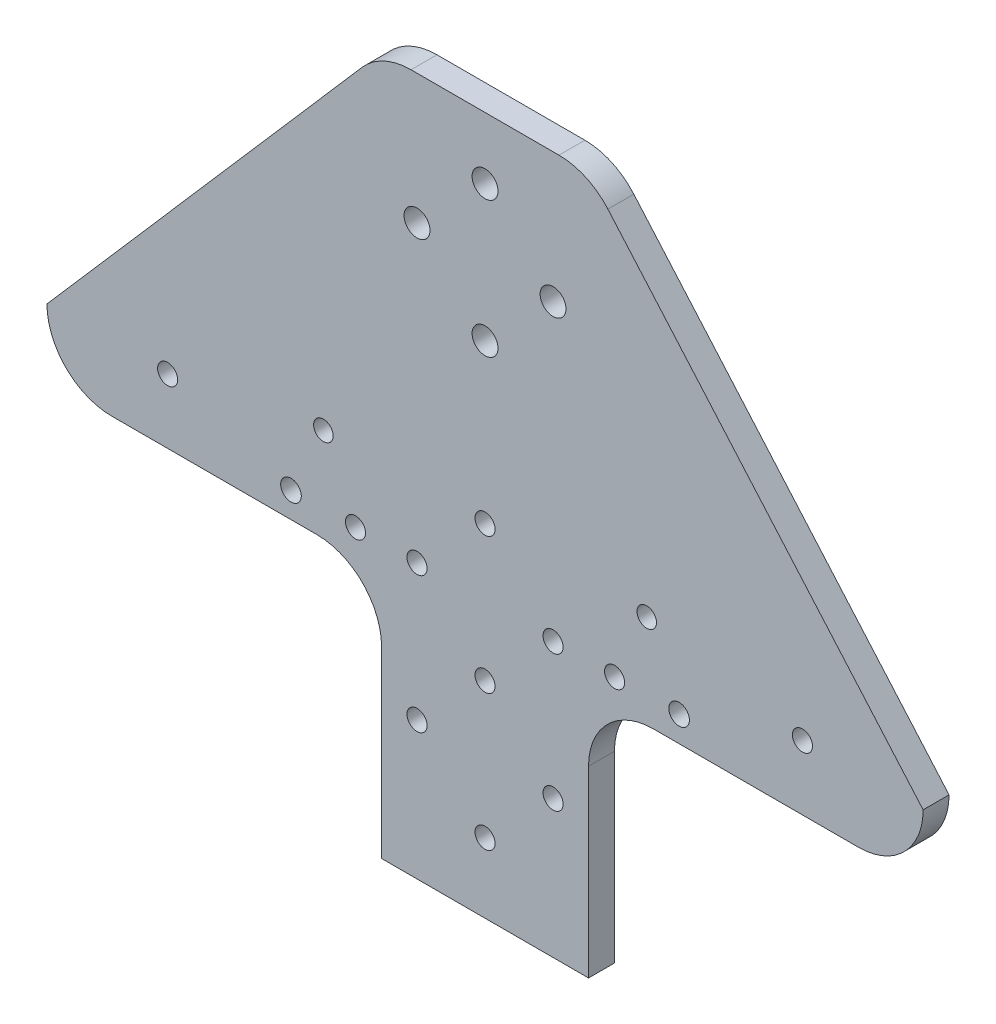
ISO-10303-21;
HEADER;
FILE_DESCRIPTION(('STEP AP214'),'2;1');
FILE_NAME('part.step','',(''),(''),'','','');
FILE_SCHEMA(('AUTOMOTIVE_DESIGN { 1 0 10303 214 1 1 1 1 }'));
ENDSEC;
DATA;
#1=APPLICATION_CONTEXT('core data for automotive mechanical design processes');
#2=APPLICATION_PROTOCOL_DEFINITION('international standard','automotive_design',2000,#1);
#3=PRODUCT_CONTEXT('',#1,'mechanical');
#4=PRODUCT('Part','Part','',(#3));
#5=PRODUCT_RELATED_PRODUCT_CATEGORY('part','',(#4));
#6=PRODUCT_DEFINITION_FORMATION('','',#4);
#7=PRODUCT_DEFINITION_CONTEXT('part definition',#1,'design');
#8=PRODUCT_DEFINITION('design','',#6,#7);
#9=PRODUCT_DEFINITION_SHAPE('','',#8);
#10=(LENGTH_UNIT() NAMED_UNIT(*) SI_UNIT(.MILLI.,.METRE.));
#11=(NAMED_UNIT(*) PLANE_ANGLE_UNIT() SI_UNIT($,.RADIAN.));
#12=(NAMED_UNIT(*) SI_UNIT($,.STERADIAN.) SOLID_ANGLE_UNIT());
#13=UNCERTAINTY_MEASURE_WITH_UNIT(LENGTH_MEASURE(1.E-05),#10,'distance_accuracy_value','');
#14=(GEOMETRIC_REPRESENTATION_CONTEXT(3) GLOBAL_UNCERTAINTY_ASSIGNED_CONTEXT((#13)) GLOBAL_UNIT_ASSIGNED_CONTEXT((#10,
#11,#12)) REPRESENTATION_CONTEXT('',''));
#15=CARTESIAN_POINT('',(0.,0.,0.));
#16=DIRECTION('',(0.,0.,1.));
#17=DIRECTION('',(1.,0.,0.));
#18=AXIS2_PLACEMENT_3D('',#15,#16,#17);
#19=CARTESIAN_POINT('',(-2.87536121791767,41.2867791801597,4.));
#20=DIRECTION('',(0.,0.,-1.));
#21=DIRECTION('',(-1.,0.,0.));
#22=AXIS2_PLACEMENT_3D('',#19,#20,#21);
#23=CYLINDRICAL_SURFACE('',#22,10.);
#24=CARTESIAN_POINT('',(-2.87536121791767,41.2867791801597,0.));
#25=DIRECTION('',(0.,0.,1.));
#26=DIRECTION('',(1.,0.,0.));
#27=AXIS2_PLACEMENT_3D('',#24,#25,#26);
#28=CIRCLE('',#27,10.);
#29=CARTESIAN_POINT('',(-10.4221156167999,47.8477621890504,0.));
#30=VERTEX_POINT('',#29);
#31=CARTESIAN_POINT('',(-2.87536121791763,51.2867791801597,0.));
#32=VERTEX_POINT('',#31);
#33=EDGE_CURVE('E227',#30,#32,#28,.F.);
#34=ORIENTED_EDGE('',*,*,#33,.F.);
#35=DIRECTION('',(0.,0.,-1.));
#36=VECTOR('',#35,1.);
#37=CARTESIAN_POINT('',(-10.4221156167999,47.8477621890504,4.));
#38=LINE('',#37,#36);
#39=CARTESIAN_POINT('',(-10.4221156167999,47.8477621890504,4.));
#40=VERTEX_POINT('',#39);
#41=EDGE_CURVE('E11',#40,#30,#38,.T.);
#42=ORIENTED_EDGE('',*,*,#41,.F.);
#43=CARTESIAN_POINT('',(-2.87536121791767,41.2867791801597,4.));
#44=DIRECTION('',(0.,0.,1.));
#45=DIRECTION('',(1.,0.,0.));
#46=AXIS2_PLACEMENT_3D('',#43,#44,#45);
#47=CIRCLE('',#46,10.);
#48=CARTESIAN_POINT('',(-2.87536121791763,51.2867791801597,4.));
#49=VERTEX_POINT('',#48);
#50=EDGE_CURVE('E319',#40,#49,#47,.F.);
#51=ORIENTED_EDGE('',*,*,#50,.T.);
#52=DIRECTION('',(0.,0.,-1.));
#53=VECTOR('',#52,1.);
#54=CARTESIAN_POINT('',(-2.87536121791763,51.2867791801597,4.));
#55=LINE('',#54,#53);
#56=EDGE_CURVE('E110',#49,#32,#55,.T.);
#57=ORIENTED_EDGE('',*,*,#56,.T.);
#58=EDGE_LOOP('',(#34,#42,#51,#57));
#59=FACE_BOUND('',#58,.T.);
#60=ADVANCED_FACE('F41',(#59),#23,.T.);
#61=CARTESIAN_POINT('',(-29.6271617421425,25.7572056168472,4.));
#62=DIRECTION('',(-0.754675439888216,0.656098300889072,0.));
#63=DIRECTION('',(-0.656098300889072,-0.754675439888216,0.));
#64=AXIS2_PLACEMENT_3D('',#61,#62,#63);
#65=PLANE('',#64);
#66=DIRECTION('',(0.656098300889072,0.754675439888217,0.));
#67=VECTOR('',#66,1.);
#68=CARTESIAN_POINT('',(-29.6271617421425,25.7572056168472,0.));
#69=LINE('',#68,#67);
#70=CARTESIAN_POINT('',(-59.0860641716321,-8.12782368359886,0.));
#71=VERTEX_POINT('',#70);
#72=EDGE_CURVE('E230',#71,#30,#69,.T.);
#73=ORIENTED_EDGE('',*,*,#72,.F.);
#74=DIRECTION('',(0.,0.,-1.));
#75=VECTOR('',#74,1.);
#76=CARTESIAN_POINT('',(-59.0860641716321,-8.12782368359886,4.));
#77=LINE('',#76,#75);
#78=CARTESIAN_POINT('',(-59.0860641716321,-8.12782368359886,4.));
#79=VERTEX_POINT('',#78);
#80=EDGE_CURVE('E49',#79,#71,#77,.T.);
#81=ORIENTED_EDGE('',*,*,#80,.F.);
#82=DIRECTION('',(0.656098300889072,0.754675439888217,0.));
#83=VECTOR('',#82,1.);
#84=CARTESIAN_POINT('',(-29.6271617421425,25.7572056168472,4.));
#85=LINE('',#84,#83);
#86=EDGE_CURVE('E363',#79,#40,#85,.T.);
#87=ORIENTED_EDGE('',*,*,#86,.T.);
#88=ORIENTED_EDGE('',*,*,#41,.T.);
#89=EDGE_LOOP('',(#73,#81,#87,#88));
#90=FACE_BOUND('',#89,.T.);
#91=ADVANCED_FACE('F350',(#90),#65,.T.);
#92=CARTESIAN_POINT('',(-49.0860641716321,-8.12782368359894,4.));
#93=DIRECTION('',(0.,0.,-1.));
#94=DIRECTION('',(-1.,0.,0.));
#95=AXIS2_PLACEMENT_3D('',#92,#93,#94);
#96=CYLINDRICAL_SURFACE('',#95,10.);
#97=CARTESIAN_POINT('',(-49.0860641716321,-8.12782368359894,0.));
#98=DIRECTION('',(0.,0.,1.));
#99=DIRECTION('',(1.,0.,0.));
#100=AXIS2_PLACEMENT_3D('',#97,#98,#99);
#101=CIRCLE('',#100,10.);
#102=CARTESIAN_POINT('',(-49.086064171632,-18.1278236835989,0.));
#103=VERTEX_POINT('',#102);
#104=EDGE_CURVE('E233',#103,#71,#101,.F.);
#105=ORIENTED_EDGE('',*,*,#104,.F.);
#106=DIRECTION('',(0.,0.,-1.));
#107=VECTOR('',#106,1.);
#108=CARTESIAN_POINT('',(-49.086064171632,-18.1278236835989,4.));
#109=LINE('',#108,#107);
#110=CARTESIAN_POINT('',(-49.086064171632,-18.1278236835989,4.));
#111=VERTEX_POINT('',#110);
#112=EDGE_CURVE('E339',#111,#103,#109,.T.);
#113=ORIENTED_EDGE('',*,*,#112,.F.);
#114=CARTESIAN_POINT('',(-49.0860641716321,-8.12782368359894,4.));
#115=DIRECTION('',(0.,0.,1.));
#116=DIRECTION('',(1.,0.,0.));
#117=AXIS2_PLACEMENT_3D('',#114,#115,#116);
#118=CIRCLE('',#117,10.);
#119=EDGE_CURVE('E346',#111,#79,#118,.F.);
#120=ORIENTED_EDGE('',*,*,#119,.T.);
#121=ORIENTED_EDGE('',*,*,#80,.T.);
#122=EDGE_LOOP('',(#105,#113,#120,#121));
#123=FACE_BOUND('',#122,.T.);
#124=ADVANCED_FACE('F344',(#123),#96,.T.);
#125=CARTESIAN_POINT('',(0.,-18.1278236835989,4.));
#126=DIRECTION('',(0.,-1.,0.));
#127=DIRECTION('',(0.,0.,-1.));
#128=AXIS2_PLACEMENT_3D('',#125,#126,#127);
#129=PLANE('',#128);
#130=DIRECTION('',(-1.,0.,0.));
#131=VECTOR('',#130,1.);
#132=CARTESIAN_POINT('',(0.,-18.1278236835989,0.));
#133=LINE('',#132,#131);
#134=CARTESIAN_POINT('',(-17.4323095553628,-18.1278236835989,0.));
#135=VERTEX_POINT('',#134);
#136=EDGE_CURVE('E236',#135,#103,#133,.T.);
#137=ORIENTED_EDGE('',*,*,#136,.F.);
#138=DIRECTION('',(0.,0.,-1.));
#139=VECTOR('',#138,1.);
#140=CARTESIAN_POINT('',(-17.4323095553628,-18.1278236835989,4.));
#141=LINE('',#140,#139);
#142=CARTESIAN_POINT('',(-17.4323095553628,-18.1278236835989,4.));
#143=VERTEX_POINT('',#142);
#144=EDGE_CURVE('E337',#143,#135,#141,.T.);
#145=ORIENTED_EDGE('',*,*,#144,.F.);
#146=DIRECTION('',(-1.,0.,0.));
#147=VECTOR('',#146,1.);
#148=CARTESIAN_POINT('',(0.,-18.1278236835989,4.));
#149=LINE('',#148,#147);
#150=EDGE_CURVE('E362',#143,#111,#149,.T.);
#151=ORIENTED_EDGE('',*,*,#150,.T.);
#152=ORIENTED_EDGE('',*,*,#112,.T.);
#153=EDGE_LOOP('',(#137,#145,#151,#152));
#154=FACE_BOUND('',#153,.T.);
#155=ADVANCED_FACE('F358',(#154),#129,.T.);
#156=CARTESIAN_POINT('',(-17.4323095553628,-28.1278236835989,4.));
#157=DIRECTION('',(0.,0.,-1.));
#158=DIRECTION('',(-1.,0.,0.));
#159=AXIS2_PLACEMENT_3D('',#156,#157,#158);
#160=CYLINDRICAL_SURFACE('',#159,9.99999999999999);
#161=CARTESIAN_POINT('',(-17.4323095553628,-28.1278236835989,0.));
#162=DIRECTION('',(0.,0.,1.));
#163=DIRECTION('',(1.,0.,0.));
#164=AXIS2_PLACEMENT_3D('',#161,#162,#163);
#165=CIRCLE('',#164,9.99999999999999);
#166=CARTESIAN_POINT('',(-7.4323095553628,-28.1278236835989,0.));
#167=VERTEX_POINT('',#166);
#168=EDGE_CURVE('E239',#135,#167,#165,.F.);
#169=ORIENTED_EDGE('',*,*,#168,.T.);
#170=DIRECTION('',(0.,0.,-1.));
#171=VECTOR('',#170,1.);
#172=CARTESIAN_POINT('',(-7.4323095553628,-28.1278236835989,4.));
#173=LINE('',#172,#171);
#174=CARTESIAN_POINT('',(-7.4323095553628,-28.1278236835989,4.));
#175=VERTEX_POINT('',#174);
#176=EDGE_CURVE('E334',#175,#167,#173,.T.);
#177=ORIENTED_EDGE('',*,*,#176,.F.);
#178=CARTESIAN_POINT('',(-17.4323095553628,-28.1278236835989,4.));
#179=DIRECTION('',(0.,0.,1.));
#180=DIRECTION('',(1.,0.,0.));
#181=AXIS2_PLACEMENT_3D('',#178,#179,#180);
#182=CIRCLE('',#181,9.99999999999999);
#183=EDGE_CURVE('E365',#143,#175,#182,.F.);
#184=ORIENTED_EDGE('',*,*,#183,.F.);
#185=ORIENTED_EDGE('',*,*,#144,.T.);
#186=EDGE_LOOP('',(#169,#177,#184,#185));
#187=FACE_BOUND('',#186,.T.);
#188=ADVANCED_FACE('F401',(#187),#160,.F.);
#189=CARTESIAN_POINT('',(-7.43230955536281,0.,4.));
#190=DIRECTION('',(1.,0.,0.));
#191=DIRECTION('',(0.,1.,0.));
#192=AXIS2_PLACEMENT_3D('',#189,#190,#191);
#193=PLANE('',#192);
#194=DIRECTION('',(0.,-1.,0.));
#195=VECTOR('',#194,1.);
#196=CARTESIAN_POINT('',(-7.43230955536281,0.,0.));
#197=LINE('',#196,#195);
#198=CARTESIAN_POINT('',(-7.4323095553628,-56.4391465771481,0.));
#199=VERTEX_POINT('',#198);
#200=EDGE_CURVE('E241',#167,#199,#197,.T.);
#201=ORIENTED_EDGE('',*,*,#200,.T.);
#202=DIRECTION('',(0.,0.,-1.));
#203=VECTOR('',#202,1.);
#204=CARTESIAN_POINT('',(-7.4323095553628,-56.4391465771481,4.));
#205=LINE('',#204,#203);
#206=CARTESIAN_POINT('',(-7.4323095553628,-56.4391465771481,4.));
#207=VERTEX_POINT('',#206);
#208=EDGE_CURVE('E331',#207,#199,#205,.T.);
#209=ORIENTED_EDGE('',*,*,#208,.F.);
#210=DIRECTION('',(0.,-1.,0.));
#211=VECTOR('',#210,1.);
#212=CARTESIAN_POINT('',(-7.43230955536281,0.,4.));
#213=LINE('',#212,#211);
#214=EDGE_CURVE('E371',#175,#207,#213,.T.);
#215=ORIENTED_EDGE('',*,*,#214,.F.);
#216=ORIENTED_EDGE('',*,*,#176,.T.);
#217=EDGE_LOOP('',(#201,#209,#215,#216));
#218=FACE_BOUND('',#217,.T.);
#219=ADVANCED_FACE('F404',(#218),#193,.F.);
#220=CARTESIAN_POINT('',(0.,-56.4391465771481,4.));
#221=DIRECTION('',(0.,1.,0.));
#222=DIRECTION('',(0.,0.,1.));
#223=AXIS2_PLACEMENT_3D('',#220,#221,#222);
#224=PLANE('',#223);
#225=DIRECTION('',(1.,0.,0.));
#226=VECTOR('',#225,1.);
#227=CARTESIAN_POINT('',(0.,-56.4391465771481,0.));
#228=LINE('',#227,#226);
#229=CARTESIAN_POINT('',(24.5196982321059,-56.4391465771481,0.));
#230=VERTEX_POINT('',#229);
#231=EDGE_CURVE('E243',#199,#230,#228,.T.);
#232=ORIENTED_EDGE('',*,*,#231,.T.);
#233=DIRECTION('',(0.,0.,-1.));
#234=VECTOR('',#233,1.);
#235=CARTESIAN_POINT('',(24.5196982321059,-56.4391465771481,4.));
#236=LINE('',#235,#234);
#237=CARTESIAN_POINT('',(24.5196982321059,-56.4391465771481,4.));
#238=VERTEX_POINT('',#237);
#239=EDGE_CURVE('E329',#238,#230,#236,.T.);
#240=ORIENTED_EDGE('',*,*,#239,.F.);
#241=DIRECTION('',(1.,0.,0.));
#242=VECTOR('',#241,1.);
#243=CARTESIAN_POINT('',(0.,-56.4391465771481,4.));
#244=LINE('',#243,#242);
#245=EDGE_CURVE('E373',#207,#238,#244,.T.);
#246=ORIENTED_EDGE('',*,*,#245,.F.);
#247=ORIENTED_EDGE('',*,*,#208,.T.);
#248=EDGE_LOOP('',(#232,#240,#246,#247));
#249=FACE_BOUND('',#248,.T.);
#250=ADVANCED_FACE('F408',(#249),#224,.F.);
#251=CARTESIAN_POINT('',(24.5196982321059,0.,4.));
#252=DIRECTION('',(1.,0.,0.));
#253=DIRECTION('',(0.,1.,0.));
#254=AXIS2_PLACEMENT_3D('',#251,#252,#253);
#255=PLANE('',#254);
#256=DIRECTION('',(0.,-1.,0.));
#257=VECTOR('',#256,1.);
#258=CARTESIAN_POINT('',(24.5196982321059,0.,0.));
#259=LINE('',#258,#257);
#260=CARTESIAN_POINT('',(24.5196982321059,-28.1278236835989,0.));
#261=VERTEX_POINT('',#260);
#262=EDGE_CURVE('E246',#261,#230,#259,.T.);
#263=ORIENTED_EDGE('',*,*,#262,.F.);
#264=DIRECTION('',(0.,0.,-1.));
#265=VECTOR('',#264,1.);
#266=CARTESIAN_POINT('',(24.5196982321059,-28.1278236835989,4.));
#267=LINE('',#266,#265);
#268=CARTESIAN_POINT('',(24.5196982321059,-28.1278236835989,4.));
#269=VERTEX_POINT('',#268);
#270=EDGE_CURVE('E327',#269,#261,#267,.T.);
#271=ORIENTED_EDGE('',*,*,#270,.F.);
#272=DIRECTION('',(0.,-1.,0.));
#273=VECTOR('',#272,1.);
#274=CARTESIAN_POINT('',(24.5196982321059,0.,4.));
#275=LINE('',#274,#273);
#276=EDGE_CURVE('E375',#269,#238,#275,.T.);
#277=ORIENTED_EDGE('',*,*,#276,.T.);
#278=ORIENTED_EDGE('',*,*,#239,.T.);
#279=EDGE_LOOP('',(#263,#271,#277,#278));
#280=FACE_BOUND('',#279,.T.);
#281=ADVANCED_FACE('F412',(#280),#255,.T.);
#282=CARTESIAN_POINT('',(34.5196982321059,-28.1278236835989,4.));
#283=DIRECTION('',(0.,0.,-1.));
#284=DIRECTION('',(-1.,0.,0.));
#285=AXIS2_PLACEMENT_3D('',#282,#283,#284);
#286=CYLINDRICAL_SURFACE('',#285,9.99999999999999);
#287=CARTESIAN_POINT('',(34.5196982321059,-28.1278236835989,0.));
#288=DIRECTION('',(0.,0.,1.));
#289=DIRECTION('',(1.,0.,0.));
#290=AXIS2_PLACEMENT_3D('',#287,#288,#289);
#291=CIRCLE('',#290,9.99999999999999);
#292=CARTESIAN_POINT('',(34.5196982321059,-18.1278236835989,0.));
#293=VERTEX_POINT('',#292);
#294=EDGE_CURVE('E249',#293,#261,#291,.T.);
#295=ORIENTED_EDGE('',*,*,#294,.F.);
#296=DIRECTION('',(0.,0.,-1.));
#297=VECTOR('',#296,1.);
#298=CARTESIAN_POINT('',(34.5196982321059,-18.1278236835989,4.));
#299=LINE('',#298,#297);
#300=CARTESIAN_POINT('',(34.5196982321059,-18.1278236835989,4.));
#301=VERTEX_POINT('',#300);
#302=EDGE_CURVE('E325',#301,#293,#299,.T.);
#303=ORIENTED_EDGE('',*,*,#302,.F.);
#304=CARTESIAN_POINT('',(34.5196982321059,-28.1278236835989,4.));
#305=DIRECTION('',(0.,0.,1.));
#306=DIRECTION('',(1.,0.,0.));
#307=AXIS2_PLACEMENT_3D('',#304,#305,#306);
#308=CIRCLE('',#307,9.99999999999999);
#309=EDGE_CURVE('E378',#301,#269,#308,.T.);
#310=ORIENTED_EDGE('',*,*,#309,.T.);
#311=ORIENTED_EDGE('',*,*,#270,.T.);
#312=EDGE_LOOP('',(#295,#303,#310,#311));
#313=FACE_BOUND('',#312,.T.);
#314=ADVANCED_FACE('F416',(#313),#286,.F.);
#315=CARTESIAN_POINT('',(0.,-18.1278236835989,4.));
#316=DIRECTION('',(0.,-1.,0.));
#317=DIRECTION('',(0.,0.,-1.));
#318=AXIS2_PLACEMENT_3D('',#315,#316,#317);
#319=PLANE('',#318);
#320=DIRECTION('',(-1.,0.,0.));
#321=VECTOR('',#320,1.);
#322=CARTESIAN_POINT('',(0.,-18.1278236835989,0.));
#323=LINE('',#322,#321);
#324=CARTESIAN_POINT('',(66.1734528483751,-18.1278236835989,0.));
#325=VERTEX_POINT('',#324);
#326=EDGE_CURVE('E252',#325,#293,#323,.T.);
#327=ORIENTED_EDGE('',*,*,#326,.F.);
#328=DIRECTION('',(0.,0.,-1.));
#329=VECTOR('',#328,1.);
#330=CARTESIAN_POINT('',(66.1734528483751,-18.1278236835989,4.));
#331=LINE('',#330,#329);
#332=CARTESIAN_POINT('',(66.1734528483751,-18.1278236835989,4.));
#333=VERTEX_POINT('',#332);
#334=EDGE_CURVE('E323',#333,#325,#331,.T.);
#335=ORIENTED_EDGE('',*,*,#334,.F.);
#336=DIRECTION('',(-1.,0.,0.));
#337=VECTOR('',#336,1.);
#338=CARTESIAN_POINT('',(0.,-18.1278236835989,4.));
#339=LINE('',#338,#337);
#340=EDGE_CURVE('E381',#333,#301,#339,.T.);
#341=ORIENTED_EDGE('',*,*,#340,.T.);
#342=ORIENTED_EDGE('',*,*,#302,.T.);
#343=EDGE_LOOP('',(#327,#335,#341,#342));
#344=FACE_BOUND('',#343,.T.);
#345=ADVANCED_FACE('F420',(#344),#319,.T.);
#346=CARTESIAN_POINT('',(66.1734528483752,-8.12782368359894,4.));
#347=DIRECTION('',(0.,0.,-1.));
#348=DIRECTION('',(-1.,0.,0.));
#349=AXIS2_PLACEMENT_3D('',#346,#347,#348);
#350=CYLINDRICAL_SURFACE('',#349,10.);
#351=CARTESIAN_POINT('',(66.1734528483752,-8.12782368359894,0.));
#352=DIRECTION('',(0.,0.,1.));
#353=DIRECTION('',(1.,0.,0.));
#354=AXIS2_PLACEMENT_3D('',#351,#352,#353);
#355=CIRCLE('',#354,10.);
#356=CARTESIAN_POINT('',(76.1734528483752,-8.12782368359887,0.));
#357=VERTEX_POINT('',#356);
#358=EDGE_CURVE('E255',#357,#325,#355,.F.);
#359=ORIENTED_EDGE('',*,*,#358,.F.);
#360=DIRECTION('',(0.,0.,-1.));
#361=VECTOR('',#360,1.);
#362=CARTESIAN_POINT('',(76.1734528483752,-8.12782368359887,4.));
#363=LINE('',#362,#361);
#364=CARTESIAN_POINT('',(76.1734528483752,-8.12782368359887,4.));
#365=VERTEX_POINT('',#364);
#366=EDGE_CURVE('E162',#365,#357,#363,.T.);
#367=ORIENTED_EDGE('',*,*,#366,.F.);
#368=CARTESIAN_POINT('',(66.1734528483752,-8.12782368359894,4.));
#369=DIRECTION('',(0.,0.,1.));
#370=DIRECTION('',(1.,0.,0.));
#371=AXIS2_PLACEMENT_3D('',#368,#369,#370);
#372=CIRCLE('',#371,10.);
#373=EDGE_CURVE('E155',#365,#333,#372,.F.);
#374=ORIENTED_EDGE('',*,*,#373,.T.);
#375=ORIENTED_EDGE('',*,*,#334,.T.);
#376=EDGE_LOOP('',(#359,#367,#374,#375));
#377=FACE_BOUND('',#376,.T.);
#378=ADVANCED_FACE('F385',(#377),#350,.T.);
#379=CARTESIAN_POINT('',(39.3590279865596,34.2178770127357,4.));
#380=DIRECTION('',(-0.754675439888216,-0.656098300889073,0.));
#381=DIRECTION('',(0.656098300889073,-0.754675439888216,0.));
#382=AXIS2_PLACEMENT_3D('',#379,#380,#381);
#383=PLANE('',#382);
#384=DIRECTION('',(-0.656098300889073,0.754675439888216,0.));
#385=VECTOR('',#384,1.);
#386=CARTESIAN_POINT('',(39.3590279865596,34.2178770127357,0.));
#387=LINE('',#386,#385);
#388=CARTESIAN_POINT('',(27.5095042935429,47.8477621890504,0.));
#389=VERTEX_POINT('',#388);
#390=EDGE_CURVE('E161',#357,#389,#387,.T.);
#391=ORIENTED_EDGE('',*,*,#390,.T.);
#392=DIRECTION('',(0.,0.,-1.));
#393=VECTOR('',#392,1.);
#394=CARTESIAN_POINT('',(27.5095042935429,47.8477621890504,4.));
#395=LINE('',#394,#393);
#396=CARTESIAN_POINT('',(27.5095042935429,47.8477621890504,4.));
#397=VERTEX_POINT('',#396);
#398=EDGE_CURVE('E158',#397,#389,#395,.T.);
#399=ORIENTED_EDGE('',*,*,#398,.F.);
#400=DIRECTION('',(-0.656098300889073,0.754675439888216,0.));
#401=VECTOR('',#400,1.);
#402=CARTESIAN_POINT('',(39.3590279865596,34.2178770127357,4.));
#403=LINE('',#402,#401);
#404=EDGE_CURVE('E147',#365,#397,#403,.T.);
#405=ORIENTED_EDGE('',*,*,#404,.F.);
#406=ORIENTED_EDGE('',*,*,#366,.T.);
#407=EDGE_LOOP('',(#391,#399,#405,#406));
#408=FACE_BOUND('',#407,.T.);
#409=ADVANCED_FACE('F159',(#408),#383,.F.);
#410=CARTESIAN_POINT('',(19.9627498946607,41.2867791801597,4.));
#411=DIRECTION('',(0.,0.,-1.));
#412=DIRECTION('',(-1.,0.,0.));
#413=AXIS2_PLACEMENT_3D('',#410,#411,#412);
#414=CYLINDRICAL_SURFACE('',#413,10.);
#415=CARTESIAN_POINT('',(19.9627498946607,41.2867791801597,0.));
#416=DIRECTION('',(0.,0.,1.));
#417=DIRECTION('',(1.,0.,0.));
#418=AXIS2_PLACEMENT_3D('',#415,#416,#417);
#419=CIRCLE('',#418,10.);
#420=CARTESIAN_POINT('',(19.9627498946607,51.2867791801597,0.));
#421=VERTEX_POINT('',#420);
#422=EDGE_CURVE('E103',#389,#421,#419,.T.);
#423=ORIENTED_EDGE('',*,*,#422,.T.);
#424=DIRECTION('',(0.,0.,-1.));
#425=VECTOR('',#424,1.);
#426=CARTESIAN_POINT('',(19.9627498946607,51.2867791801597,4.));
#427=LINE('',#426,#425);
#428=CARTESIAN_POINT('',(19.9627498946607,51.2867791801597,4.));
#429=VERTEX_POINT('',#428);
#430=EDGE_CURVE('E163',#429,#421,#427,.T.);
#431=ORIENTED_EDGE('',*,*,#430,.F.);
#432=CARTESIAN_POINT('',(19.9627498946607,41.2867791801597,4.));
#433=DIRECTION('',(0.,0.,1.));
#434=DIRECTION('',(1.,0.,0.));
#435=AXIS2_PLACEMENT_3D('',#432,#433,#434);
#436=CIRCLE('',#435,10.);
#437=EDGE_CURVE('E152',#397,#429,#436,.T.);
#438=ORIENTED_EDGE('',*,*,#437,.F.);
#439=ORIENTED_EDGE('',*,*,#398,.T.);
#440=EDGE_LOOP('',(#423,#431,#438,#439));
#441=FACE_BOUND('',#440,.T.);
#442=ADVANCED_FACE('F165',(#441),#414,.T.);
#443=CARTESIAN_POINT('',(38.5018706484388,-14.1858288819222,4.));
#444=DIRECTION('',(0.,0.,-1.));
#445=DIRECTION('',(-1.,0.,0.));
#446=AXIS2_PLACEMENT_3D('',#443,#444,#445);
#447=CYLINDRICAL_SURFACE('',#446,1.59340769892465);
#448=CARTESIAN_POINT('',(38.5018706484388,-14.1858288819222,4.));
#449=DIRECTION('',(0.,0.,1.));
#450=DIRECTION('',(1.,0.,0.));
#451=AXIS2_PLACEMENT_3D('',#448,#449,#450);
#452=CIRCLE('',#451,1.59340769892465);
#453=CARTESIAN_POINT('',(40.0952783473634,-14.1858288819222,4.));
#454=VERTEX_POINT('',#453);
#455=EDGE_CURVE('E221',#454,#454,#452,.F.);
#456=ORIENTED_EDGE('',*,*,#455,.F.);
#457=EDGE_LOOP('',(#456));
#458=FACE_BOUND('',#457,.T.);
#459=CARTESIAN_POINT('',(38.5018706484388,-14.1858288819222,0.));
#460=DIRECTION('',(0.,0.,1.));
#461=DIRECTION('',(1.,0.,0.));
#462=AXIS2_PLACEMENT_3D('',#459,#460,#461);
#463=CIRCLE('',#462,1.59340769892465);
#464=CARTESIAN_POINT('',(40.0952783473634,-14.1858288819222,0.));
#465=VERTEX_POINT('',#464);
#466=EDGE_CURVE('E313',#465,#465,#463,.F.);
#467=ORIENTED_EDGE('',*,*,#466,.T.);
#468=EDGE_LOOP('',(#467));
#469=FACE_BOUND('',#468,.T.);
#470=ADVANCED_FACE('F431',(#458,#469),#447,.F.);
#471=CARTESIAN_POINT('',(19.0436943383716,-14.1742096183337,4.));
#472=DIRECTION('',(0.,0.,-1.));
#473=DIRECTION('',(-1.,0.,0.));
#474=AXIS2_PLACEMENT_3D('',#471,#472,#473);
#475=CYLINDRICAL_SURFACE('',#474,1.55);
#476=CARTESIAN_POINT('',(19.0436943383716,-14.1742096183337,4.));
#477=DIRECTION('',(0.,0.,1.));
#478=DIRECTION('',(1.,0.,0.));
#479=AXIS2_PLACEMENT_3D('',#476,#477,#478);
#480=CIRCLE('',#479,1.55);
#481=CARTESIAN_POINT('',(20.5936943383716,-14.1742096183337,4.));
#482=VERTEX_POINT('',#481);
#483=EDGE_CURVE('E218',#482,#482,#480,.F.);
#484=ORIENTED_EDGE('',*,*,#483,.F.);
#485=EDGE_LOOP('',(#484));
#486=FACE_BOUND('',#485,.T.);
#487=CARTESIAN_POINT('',(19.0436943383716,-14.1742096183337,0.));
#488=DIRECTION('',(0.,0.,1.));
#489=DIRECTION('',(1.,0.,0.));
#490=AXIS2_PLACEMENT_3D('',#487,#488,#489);
#491=CIRCLE('',#490,1.55);
#492=CARTESIAN_POINT('',(20.5936943383716,-14.1742096183337,0.));
#493=VERTEX_POINT('',#492);
#494=EDGE_CURVE('E310',#493,#493,#491,.F.);
#495=ORIENTED_EDGE('',*,*,#494,.T.);
#496=EDGE_LOOP('',(#495));
#497=FACE_BOUND('',#496,.T.);
#498=ADVANCED_FACE('F498',(#486,#497),#475,.F.);
#499=CARTESIAN_POINT('',(-40.4563056616284,-8.17420961833371,4.));
#500=DIRECTION('',(0.,0.,-1.));
#501=DIRECTION('',(-1.,0.,0.));
#502=AXIS2_PLACEMENT_3D('',#499,#500,#501);
#503=CYLINDRICAL_SURFACE('',#502,1.54999999999998);
#504=CARTESIAN_POINT('',(-40.4563056616284,-8.17420961833371,4.));
#505=DIRECTION('',(0.,0.,1.));
#506=DIRECTION('',(1.,0.,0.));
#507=AXIS2_PLACEMENT_3D('',#504,#505,#506);
#508=CIRCLE('',#507,1.54999999999998);
#509=CARTESIAN_POINT('',(-38.9063056616285,-8.17420961833371,4.));
#510=VERTEX_POINT('',#509);
#511=EDGE_CURVE('E215',#510,#510,#508,.T.);
#512=ORIENTED_EDGE('',*,*,#511,.T.);
#513=EDGE_LOOP('',(#512));
#514=FACE_BOUND('',#513,.T.);
#515=CARTESIAN_POINT('',(-40.4563056616284,-8.17420961833371,0.));
#516=DIRECTION('',(0.,0.,1.));
#517=DIRECTION('',(1.,0.,0.));
#518=AXIS2_PLACEMENT_3D('',#515,#516,#517);
#519=CIRCLE('',#518,1.54999999999998);
#520=CARTESIAN_POINT('',(-38.9063056616285,-8.17420961833371,0.));
#521=VERTEX_POINT('',#520);
#522=EDGE_CURVE('E307',#521,#521,#519,.T.);
#523=ORIENTED_EDGE('',*,*,#522,.F.);
#524=EDGE_LOOP('',(#523));
#525=FACE_BOUND('',#524,.T.);
#526=ADVANCED_FACE('F494',(#514,#525),#503,.F.);
#527=CARTESIAN_POINT('',(8.54369433837157,41.7637388040521,4.));
#528=DIRECTION('',(0.,0.,-1.));
#529=DIRECTION('',(-1.,0.,0.));
#530=AXIS2_PLACEMENT_3D('',#527,#528,#529);
#531=CYLINDRICAL_SURFACE('',#530,2.);
#532=CARTESIAN_POINT('',(8.54369433837157,41.7637388040521,4.));
#533=DIRECTION('',(0.,0.,1.));
#534=DIRECTION('',(1.,0.,0.));
#535=AXIS2_PLACEMENT_3D('',#532,#533,#534);
#536=CIRCLE('',#535,2.);
#537=CARTESIAN_POINT('',(10.5436943383716,41.7637388040521,4.));
#538=VERTEX_POINT('',#537);
#539=EDGE_CURVE('E212',#538,#538,#536,.T.);
#540=ORIENTED_EDGE('',*,*,#539,.T.);
#541=EDGE_LOOP('',(#540));
#542=FACE_BOUND('',#541,.T.);
#543=CARTESIAN_POINT('',(8.54369433837157,41.7637388040521,0.));
#544=DIRECTION('',(0.,0.,1.));
#545=DIRECTION('',(1.,0.,0.));
#546=AXIS2_PLACEMENT_3D('',#543,#544,#545);
#547=CIRCLE('',#546,2.);
#548=CARTESIAN_POINT('',(10.5436943383716,41.7637388040521,0.));
#549=VERTEX_POINT('',#548);
#550=EDGE_CURVE('E304',#549,#549,#547,.T.);
#551=ORIENTED_EDGE('',*,*,#550,.F.);
#552=EDGE_LOOP('',(#551));
#553=FACE_BOUND('',#552,.T.);
#554=ADVANCED_FACE('F490',(#542,#553),#531,.F.);
#555=CARTESIAN_POINT('',(19.0436943383715,31.2637388040521,4.));
#556=DIRECTION('',(0.,0.,-1.));
#557=DIRECTION('',(-1.,0.,0.));
#558=AXIS2_PLACEMENT_3D('',#555,#556,#557);
#559=CYLINDRICAL_SURFACE('',#558,2.);
#560=CARTESIAN_POINT('',(19.0436943383715,31.2637388040521,4.));
#561=DIRECTION('',(0.,0.,1.));
#562=DIRECTION('',(1.,0.,0.));
#563=AXIS2_PLACEMENT_3D('',#560,#561,#562);
#564=CIRCLE('',#563,2.);
#565=CARTESIAN_POINT('',(21.0436943383715,31.2637388040521,4.));
#566=VERTEX_POINT('',#565);
#567=EDGE_CURVE('E209',#566,#566,#564,.T.);
#568=ORIENTED_EDGE('',*,*,#567,.T.);
#569=EDGE_LOOP('',(#568));
#570=FACE_BOUND('',#569,.T.);
#571=CARTESIAN_POINT('',(19.0436943383715,31.2637388040521,0.));
#572=DIRECTION('',(0.,0.,1.));
#573=DIRECTION('',(1.,0.,0.));
#574=AXIS2_PLACEMENT_3D('',#571,#572,#573);
#575=CIRCLE('',#574,2.);
#576=CARTESIAN_POINT('',(21.0436943383715,31.2637388040521,0.));
#577=VERTEX_POINT('',#576);
#578=EDGE_CURVE('E301',#577,#577,#575,.T.);
#579=ORIENTED_EDGE('',*,*,#578,.F.);
#580=EDGE_LOOP('',(#579));
#581=FACE_BOUND('',#580,.T.);
#582=ADVANCED_FACE('F486',(#570,#581),#559,.F.);
#583=CARTESIAN_POINT('',(8.54369433837157,20.7637388040521,4.));
#584=DIRECTION('',(0.,0.,-1.));
#585=DIRECTION('',(-1.,0.,0.));
#586=AXIS2_PLACEMENT_3D('',#583,#584,#585);
#587=CYLINDRICAL_SURFACE('',#586,2.);
#588=CARTESIAN_POINT('',(8.54369433837157,20.7637388040521,4.));
#589=DIRECTION('',(0.,0.,1.));
#590=DIRECTION('',(1.,0.,0.));
#591=AXIS2_PLACEMENT_3D('',#588,#589,#590);
#592=CIRCLE('',#591,2.);
#593=CARTESIAN_POINT('',(10.5436943383716,20.7637388040521,4.));
#594=VERTEX_POINT('',#593);
#595=EDGE_CURVE('E206',#594,#594,#592,.T.);
#596=ORIENTED_EDGE('',*,*,#595,.T.);
#597=EDGE_LOOP('',(#596));
#598=FACE_BOUND('',#597,.T.);
#599=CARTESIAN_POINT('',(8.54369433837157,20.7637388040521,0.));
#600=DIRECTION('',(0.,0.,1.));
#601=DIRECTION('',(1.,0.,0.));
#602=AXIS2_PLACEMENT_3D('',#599,#600,#601);
#603=CIRCLE('',#602,2.);
#604=CARTESIAN_POINT('',(10.5436943383716,20.7637388040521,0.));
#605=VERTEX_POINT('',#604);
#606=EDGE_CURVE('E298',#605,#605,#603,.T.);
#607=ORIENTED_EDGE('',*,*,#606,.F.);
#608=EDGE_LOOP('',(#607));
#609=FACE_BOUND('',#608,.T.);
#610=ADVANCED_FACE('F482',(#598,#609),#587,.F.);
#611=CARTESIAN_POINT('',(-1.9563056616284,31.2637388040521,4.));
#612=DIRECTION('',(0.,0.,-1.));
#613=DIRECTION('',(-1.,0.,0.));
#614=AXIS2_PLACEMENT_3D('',#611,#612,#613);
#615=CYLINDRICAL_SURFACE('',#614,2.);
#616=CARTESIAN_POINT('',(-1.9563056616284,31.2637388040521,4.));
#617=DIRECTION('',(0.,0.,1.));
#618=DIRECTION('',(1.,0.,0.));
#619=AXIS2_PLACEMENT_3D('',#616,#617,#618);
#620=CIRCLE('',#619,2.);
#621=CARTESIAN_POINT('',(0.0436943383715954,31.2637388040521,4.));
#622=VERTEX_POINT('',#621);
#623=EDGE_CURVE('E203',#622,#622,#620,.T.);
#624=ORIENTED_EDGE('',*,*,#623,.T.);
#625=EDGE_LOOP('',(#624));
#626=FACE_BOUND('',#625,.T.);
#627=CARTESIAN_POINT('',(-1.9563056616284,31.2637388040521,0.));
#628=DIRECTION('',(0.,0.,1.));
#629=DIRECTION('',(1.,0.,0.));
#630=AXIS2_PLACEMENT_3D('',#627,#628,#629);
#631=CIRCLE('',#630,2.);
#632=CARTESIAN_POINT('',(0.0436943383715954,31.2637388040521,0.));
#633=VERTEX_POINT('',#632);
#634=EDGE_CURVE('E295',#633,#633,#631,.T.);
#635=ORIENTED_EDGE('',*,*,#634,.F.);
#636=EDGE_LOOP('',(#635));
#637=FACE_BOUND('',#636,.T.);
#638=ADVANCED_FACE('F478',(#626,#637),#615,.F.);
#639=CARTESIAN_POINT('',(-21.4144819716957,-14.1858288819222,4.));
#640=DIRECTION('',(0.,0.,-1.));
#641=DIRECTION('',(-1.,0.,0.));
#642=AXIS2_PLACEMENT_3D('',#639,#640,#641);
#643=CYLINDRICAL_SURFACE('',#642,1.59340769892466);
#644=CARTESIAN_POINT('',(-21.4144819716957,-14.1858288819222,4.));
#645=DIRECTION('',(0.,0.,1.));
#646=DIRECTION('',(1.,0.,0.));
#647=AXIS2_PLACEMENT_3D('',#644,#645,#646);
#648=CIRCLE('',#647,1.59340769892466);
#649=CARTESIAN_POINT('',(-19.821074272771,-14.1858288819222,4.));
#650=VERTEX_POINT('',#649);
#651=EDGE_CURVE('E200',#650,#650,#648,.T.);
#652=ORIENTED_EDGE('',*,*,#651,.T.);
#653=EDGE_LOOP('',(#652));
#654=FACE_BOUND('',#653,.T.);
#655=CARTESIAN_POINT('',(-21.4144819716957,-14.1858288819222,0.));
#656=DIRECTION('',(0.,0.,1.));
#657=DIRECTION('',(1.,0.,0.));
#658=AXIS2_PLACEMENT_3D('',#655,#656,#657);
#659=CIRCLE('',#658,1.59340769892466);
#660=CARTESIAN_POINT('',(-19.821074272771,-14.1858288819222,0.));
#661=VERTEX_POINT('',#660);
#662=EDGE_CURVE('E292',#661,#661,#659,.T.);
#663=ORIENTED_EDGE('',*,*,#662,.F.);
#664=EDGE_LOOP('',(#663));
#665=FACE_BOUND('',#664,.T.);
#666=ADVANCED_FACE('F474',(#654,#665),#643,.F.);
#667=CARTESIAN_POINT('',(8.54369433837156,-24.6742096183337,4.));
#668=DIRECTION('',(0.,0.,-1.));
#669=DIRECTION('',(-1.,0.,0.));
#670=AXIS2_PLACEMENT_3D('',#667,#668,#669);
#671=CYLINDRICAL_SURFACE('',#670,1.5465836530477);
#672=CARTESIAN_POINT('',(8.54369433837156,-24.6742096183337,4.));
#673=DIRECTION('',(0.,0.,1.));
#674=DIRECTION('',(1.,0.,0.));
#675=AXIS2_PLACEMENT_3D('',#672,#673,#674);
#676=CIRCLE('',#675,1.5465836530477);
#677=CARTESIAN_POINT('',(10.0902779914193,-24.6742096183337,4.));
#678=VERTEX_POINT('',#677);
#679=EDGE_CURVE('E197',#678,#678,#676,.T.);
#680=ORIENTED_EDGE('',*,*,#679,.T.);
#681=EDGE_LOOP('',(#680));
#682=FACE_BOUND('',#681,.T.);
#683=CARTESIAN_POINT('',(8.54369433837156,-24.6742096183337,0.));
#684=DIRECTION('',(0.,0.,1.));
#685=DIRECTION('',(1.,0.,0.));
#686=AXIS2_PLACEMENT_3D('',#683,#684,#685);
#687=CIRCLE('',#686,1.5465836530477);
#688=CARTESIAN_POINT('',(10.0902779914193,-24.6742096183337,0.));
#689=VERTEX_POINT('',#688);
#690=EDGE_CURVE('E289',#689,#689,#687,.T.);
#691=ORIENTED_EDGE('',*,*,#690,.F.);
#692=EDGE_LOOP('',(#691));
#693=FACE_BOUND('',#692,.T.);
#694=ADVANCED_FACE('F470',(#682,#693),#671,.F.);
#695=CARTESIAN_POINT('',(-11.4563056616285,-14.1742096183337,4.));
#696=DIRECTION('',(0.,0.,-1.));
#697=DIRECTION('',(-1.,0.,0.));
#698=AXIS2_PLACEMENT_3D('',#695,#696,#697);
#699=CYLINDRICAL_SURFACE('',#698,1.55);
#700=CARTESIAN_POINT('',(-11.4563056616285,-14.1742096183337,4.));
#701=DIRECTION('',(0.,0.,1.));
#702=DIRECTION('',(1.,0.,0.));
#703=AXIS2_PLACEMENT_3D('',#700,#701,#702);
#704=CIRCLE('',#703,1.55);
#705=CARTESIAN_POINT('',(-9.90630566162846,-14.1742096183337,4.));
#706=VERTEX_POINT('',#705);
#707=EDGE_CURVE('E194',#706,#706,#704,.T.);
#708=ORIENTED_EDGE('',*,*,#707,.T.);
#709=EDGE_LOOP('',(#708));
#710=FACE_BOUND('',#709,.T.);
#711=CARTESIAN_POINT('',(-11.4563056616285,-14.1742096183337,0.));
#712=DIRECTION('',(0.,0.,1.));
#713=DIRECTION('',(1.,0.,0.));
#714=AXIS2_PLACEMENT_3D('',#711,#712,#713);
#715=CIRCLE('',#714,1.55);
#716=CARTESIAN_POINT('',(-9.90630566162846,-14.1742096183337,0.));
#717=VERTEX_POINT('',#716);
#718=EDGE_CURVE('E286',#717,#717,#715,.T.);
#719=ORIENTED_EDGE('',*,*,#718,.F.);
#720=EDGE_LOOP('',(#719));
#721=FACE_BOUND('',#720,.T.);
#722=ADVANCED_FACE('F466',(#710,#721),#699,.F.);
#723=CARTESIAN_POINT('',(-1.95630566162845,-14.1742096183337,4.));
#724=DIRECTION('',(0.,0.,-1.));
#725=DIRECTION('',(-1.,0.,0.));
#726=AXIS2_PLACEMENT_3D('',#723,#724,#725);
#727=CYLINDRICAL_SURFACE('',#726,1.55);
#728=CARTESIAN_POINT('',(-1.95630566162845,-14.1742096183337,4.));
#729=DIRECTION('',(0.,0.,1.));
#730=DIRECTION('',(1.,0.,0.));
#731=AXIS2_PLACEMENT_3D('',#728,#729,#730);
#732=CIRCLE('',#731,1.55);
#733=CARTESIAN_POINT('',(-0.406305661628454,-14.1742096183337,4.));
#734=VERTEX_POINT('',#733);
#735=EDGE_CURVE('E191',#734,#734,#732,.T.);
#736=ORIENTED_EDGE('',*,*,#735,.T.);
#737=EDGE_LOOP('',(#736));
#738=FACE_BOUND('',#737,.T.);
#739=CARTESIAN_POINT('',(-1.95630566162845,-14.1742096183337,0.));
#740=DIRECTION('',(0.,0.,1.));
#741=DIRECTION('',(1.,0.,0.));
#742=AXIS2_PLACEMENT_3D('',#739,#740,#741);
#743=CIRCLE('',#742,1.55);
#744=CARTESIAN_POINT('',(-0.406305661628454,-14.1742096183337,0.));
#745=VERTEX_POINT('',#744);
#746=EDGE_CURVE('E283',#745,#745,#743,.T.);
#747=ORIENTED_EDGE('',*,*,#746,.F.);
#748=EDGE_LOOP('',(#747));
#749=FACE_BOUND('',#748,.T.);
#750=ADVANCED_FACE('F462',(#738,#749),#727,.F.);
#751=CARTESIAN_POINT('',(-16.4144819716957,-3.68582888192223,4.));
#752=DIRECTION('',(0.,0.,-1.));
#753=DIRECTION('',(-1.,0.,0.));
#754=AXIS2_PLACEMENT_3D('',#751,#752,#753);
#755=CYLINDRICAL_SURFACE('',#754,1.50659230107533);
#756=CARTESIAN_POINT('',(-16.4144819716957,-3.68582888192223,4.));
#757=DIRECTION('',(0.,0.,1.));
#758=DIRECTION('',(1.,0.,0.));
#759=AXIS2_PLACEMENT_3D('',#756,#757,#758);
#760=CIRCLE('',#759,1.50659230107533);
#761=CARTESIAN_POINT('',(-14.9078896706203,-3.68582888192223,4.));
#762=VERTEX_POINT('',#761);
#763=EDGE_CURVE('E188',#762,#762,#760,.T.);
#764=ORIENTED_EDGE('',*,*,#763,.T.);
#765=EDGE_LOOP('',(#764));
#766=FACE_BOUND('',#765,.T.);
#767=CARTESIAN_POINT('',(-16.4144819716957,-3.68582888192223,0.));
#768=DIRECTION('',(0.,0.,1.));
#769=DIRECTION('',(1.,0.,0.));
#770=AXIS2_PLACEMENT_3D('',#767,#768,#769);
#771=CIRCLE('',#770,1.50659230107533);
#772=CARTESIAN_POINT('',(-14.9078896706203,-3.68582888192223,0.));
#773=VERTEX_POINT('',#772);
#774=EDGE_CURVE('E280',#773,#773,#771,.T.);
#775=ORIENTED_EDGE('',*,*,#774,.F.);
#776=EDGE_LOOP('',(#775));
#777=FACE_BOUND('',#776,.T.);
#778=ADVANCED_FACE('F458',(#766,#777),#755,.F.);
#779=CARTESIAN_POINT('',(8.54369433837157,-3.67420961833367,4.));
#780=DIRECTION('',(0.,0.,-1.));
#781=DIRECTION('',(-1.,0.,0.));
#782=AXIS2_PLACEMENT_3D('',#779,#780,#781);
#783=CYLINDRICAL_SURFACE('',#782,1.55);
#784=CARTESIAN_POINT('',(8.54369433837157,-3.67420961833367,4.));
#785=DIRECTION('',(0.,0.,1.));
#786=DIRECTION('',(1.,0.,0.));
#787=AXIS2_PLACEMENT_3D('',#784,#785,#786);
#788=CIRCLE('',#787,1.55);
#789=CARTESIAN_POINT('',(10.0936943383716,-3.67420961833367,4.));
#790=VERTEX_POINT('',#789);
#791=EDGE_CURVE('E185',#790,#790,#788,.T.);
#792=ORIENTED_EDGE('',*,*,#791,.T.);
#793=EDGE_LOOP('',(#792));
#794=FACE_BOUND('',#793,.T.);
#795=CARTESIAN_POINT('',(8.54369433837157,-3.67420961833367,0.));
#796=DIRECTION('',(0.,0.,1.));
#797=DIRECTION('',(1.,0.,0.));
#798=AXIS2_PLACEMENT_3D('',#795,#796,#797);
#799=CIRCLE('',#798,1.55);
#800=CARTESIAN_POINT('',(10.0936943383716,-3.67420961833367,0.));
#801=VERTEX_POINT('',#800);
#802=EDGE_CURVE('E277',#801,#801,#799,.T.);
#803=ORIENTED_EDGE('',*,*,#802,.F.);
#804=EDGE_LOOP('',(#803));
#805=FACE_BOUND('',#804,.T.);
#806=ADVANCED_FACE('F454',(#794,#805),#783,.F.);
#807=CARTESIAN_POINT('',(-1.95630566162844,-35.1742096183337,4.));
#808=DIRECTION('',(0.,0.,-1.));
#809=DIRECTION('',(-1.,0.,0.));
#810=AXIS2_PLACEMENT_3D('',#807,#808,#809);
#811=CYLINDRICAL_SURFACE('',#810,1.55);
#812=CARTESIAN_POINT('',(-1.95630566162844,-35.1742096183337,4.));
#813=DIRECTION('',(0.,0.,1.));
#814=DIRECTION('',(1.,0.,0.));
#815=AXIS2_PLACEMENT_3D('',#812,#813,#814);
#816=CIRCLE('',#815,1.55);
#817=CARTESIAN_POINT('',(-0.406305661628446,-35.1742096183337,4.));
#818=VERTEX_POINT('',#817);
#819=EDGE_CURVE('E182',#818,#818,#816,.T.);
#820=ORIENTED_EDGE('',*,*,#819,.T.);
#821=EDGE_LOOP('',(#820));
#822=FACE_BOUND('',#821,.T.);
#823=CARTESIAN_POINT('',(-1.95630566162844,-35.1742096183337,0.));
#824=DIRECTION('',(0.,0.,1.));
#825=DIRECTION('',(1.,0.,0.));
#826=AXIS2_PLACEMENT_3D('',#823,#824,#825);
#827=CIRCLE('',#826,1.55);
#828=CARTESIAN_POINT('',(-0.406305661628446,-35.1742096183337,0.));
#829=VERTEX_POINT('',#828);
#830=EDGE_CURVE('E274',#829,#829,#827,.T.);
#831=ORIENTED_EDGE('',*,*,#830,.F.);
#832=EDGE_LOOP('',(#831));
#833=FACE_BOUND('',#832,.T.);
#834=ADVANCED_FACE('F450',(#822,#833),#811,.F.);
#835=CARTESIAN_POINT('',(8.54369433837158,-45.6742096183337,4.));
#836=DIRECTION('',(0.,0.,-1.));
#837=DIRECTION('',(-1.,0.,0.));
#838=AXIS2_PLACEMENT_3D('',#835,#836,#837);
#839=CYLINDRICAL_SURFACE('',#838,1.55);
#840=CARTESIAN_POINT('',(8.54369433837158,-45.6742096183337,4.));
#841=DIRECTION('',(0.,0.,1.));
#842=DIRECTION('',(1.,0.,0.));
#843=AXIS2_PLACEMENT_3D('',#840,#841,#842);
#844=CIRCLE('',#843,1.55);
#845=CARTESIAN_POINT('',(10.0936943383716,-45.6742096183337,4.));
#846=VERTEX_POINT('',#845);
#847=EDGE_CURVE('E179',#846,#846,#844,.T.);
#848=ORIENTED_EDGE('',*,*,#847,.T.);
#849=EDGE_LOOP('',(#848));
#850=FACE_BOUND('',#849,.T.);
#851=CARTESIAN_POINT('',(8.54369433837158,-45.6742096183337,0.));
#852=DIRECTION('',(0.,0.,1.));
#853=DIRECTION('',(1.,0.,0.));
#854=AXIS2_PLACEMENT_3D('',#851,#852,#853);
#855=CIRCLE('',#854,1.55);
#856=CARTESIAN_POINT('',(10.0936943383716,-45.6742096183337,0.));
#857=VERTEX_POINT('',#856);
#858=EDGE_CURVE('E271',#857,#857,#855,.T.);
#859=ORIENTED_EDGE('',*,*,#858,.F.);
#860=EDGE_LOOP('',(#859));
#861=FACE_BOUND('',#860,.T.);
#862=ADVANCED_FACE('F446',(#850,#861),#839,.F.);
#863=CARTESIAN_POINT('',(19.0436943383716,-35.1742096183337,4.));
#864=DIRECTION('',(0.,0.,-1.));
#865=DIRECTION('',(-1.,0.,0.));
#866=AXIS2_PLACEMENT_3D('',#863,#864,#865);
#867=CYLINDRICAL_SURFACE('',#866,1.54999999999999);
#868=CARTESIAN_POINT('',(19.0436943383716,-35.1742096183337,4.));
#869=DIRECTION('',(0.,0.,1.));
#870=DIRECTION('',(1.,0.,0.));
#871=AXIS2_PLACEMENT_3D('',#868,#869,#870);
#872=CIRCLE('',#871,1.54999999999999);
#873=CARTESIAN_POINT('',(20.5936943383716,-35.1742096183337,4.));
#874=VERTEX_POINT('',#873);
#875=EDGE_CURVE('E176',#874,#874,#872,.F.);
#876=ORIENTED_EDGE('',*,*,#875,.F.);
#877=EDGE_LOOP('',(#876));
#878=FACE_BOUND('',#877,.T.);
#879=CARTESIAN_POINT('',(19.0436943383716,-35.1742096183337,0.));
#880=DIRECTION('',(0.,0.,1.));
#881=DIRECTION('',(1.,0.,0.));
#882=AXIS2_PLACEMENT_3D('',#879,#880,#881);
#883=CIRCLE('',#882,1.54999999999999);
#884=CARTESIAN_POINT('',(20.5936943383716,-35.1742096183337,0.));
#885=VERTEX_POINT('',#884);
#886=EDGE_CURVE('E268',#885,#885,#883,.F.);
#887=ORIENTED_EDGE('',*,*,#886,.T.);
#888=EDGE_LOOP('',(#887));
#889=FACE_BOUND('',#888,.T.);
#890=ADVANCED_FACE('F442',(#878,#889),#867,.F.);
#891=CARTESIAN_POINT('',(28.5436943383716,-14.1742096183337,4.));
#892=DIRECTION('',(0.,0.,-1.));
#893=DIRECTION('',(-1.,0.,0.));
#894=AXIS2_PLACEMENT_3D('',#891,#892,#893);
#895=CYLINDRICAL_SURFACE('',#894,1.54999999999999);
#896=CARTESIAN_POINT('',(28.5436943383716,-14.1742096183337,4.));
#897=DIRECTION('',(0.,0.,1.));
#898=DIRECTION('',(1.,0.,0.));
#899=AXIS2_PLACEMENT_3D('',#896,#897,#898);
#900=CIRCLE('',#899,1.54999999999999);
#901=CARTESIAN_POINT('',(30.0936943383716,-14.1742096183337,4.));
#902=VERTEX_POINT('',#901);
#903=EDGE_CURVE('E173',#902,#902,#900,.F.);
#904=ORIENTED_EDGE('',*,*,#903,.F.);
#905=EDGE_LOOP('',(#904));
#906=FACE_BOUND('',#905,.T.);
#907=CARTESIAN_POINT('',(28.5436943383716,-14.1742096183337,0.));
#908=DIRECTION('',(0.,0.,1.));
#909=DIRECTION('',(1.,0.,0.));
#910=AXIS2_PLACEMENT_3D('',#907,#908,#909);
#911=CIRCLE('',#910,1.54999999999999);
#912=CARTESIAN_POINT('',(30.0936943383716,-14.1742096183337,0.));
#913=VERTEX_POINT('',#912);
#914=EDGE_CURVE('E265',#913,#913,#911,.F.);
#915=ORIENTED_EDGE('',*,*,#914,.T.);
#916=EDGE_LOOP('',(#915));
#917=FACE_BOUND('',#916,.T.);
#918=ADVANCED_FACE('F438',(#906,#917),#895,.F.);
#919=CARTESIAN_POINT('',(33.5018706484388,-3.68582888192222,4.));
#920=DIRECTION('',(0.,0.,-1.));
#921=DIRECTION('',(-1.,0.,0.));
#922=AXIS2_PLACEMENT_3D('',#919,#920,#921);
#923=CYLINDRICAL_SURFACE('',#922,1.50659230107533);
#924=CARTESIAN_POINT('',(33.5018706484388,-3.68582888192222,4.));
#925=DIRECTION('',(0.,0.,1.));
#926=DIRECTION('',(1.,0.,0.));
#927=AXIS2_PLACEMENT_3D('',#924,#925,#926);
#928=CIRCLE('',#927,1.50659230107533);
#929=CARTESIAN_POINT('',(35.0084629495141,-3.68582888192222,4.));
#930=VERTEX_POINT('',#929);
#931=EDGE_CURVE('E167',#930,#930,#928,.F.);
#932=ORIENTED_EDGE('',*,*,#931,.F.);
#933=EDGE_LOOP('',(#932));
#934=FACE_BOUND('',#933,.T.);
#935=CARTESIAN_POINT('',(33.5018706484388,-3.68582888192222,0.));
#936=DIRECTION('',(0.,0.,1.));
#937=DIRECTION('',(1.,0.,0.));
#938=AXIS2_PLACEMENT_3D('',#935,#936,#937);
#939=CIRCLE('',#938,1.50659230107533);
#940=CARTESIAN_POINT('',(35.0084629495141,-3.68582888192222,0.));
#941=VERTEX_POINT('',#940);
#942=EDGE_CURVE('E262',#941,#941,#939,.F.);
#943=ORIENTED_EDGE('',*,*,#942,.T.);
#944=EDGE_LOOP('',(#943));
#945=FACE_BOUND('',#944,.T.);
#946=ADVANCED_FACE('F435',(#934,#945),#923,.F.);
#947=CARTESIAN_POINT('',(1.86989292231744E-13,51.2867791801598,4.));
#948=DIRECTION('',(0.,-1.,0.));
#949=DIRECTION('',(1.,0.,0.));
#950=AXIS2_PLACEMENT_3D('',#947,#948,#949);
#951=PLANE('',#950);
#952=DIRECTION('',(-1.,0.,0.));
#953=VECTOR('',#952,1.);
#954=CARTESIAN_POINT('',(1.86989292231744E-13,51.2867791801598,0.));
#955=LINE('',#954,#953);
#956=EDGE_CURVE('E260',#421,#32,#955,.T.);
#957=ORIENTED_EDGE('',*,*,#956,.T.);
#958=ORIENTED_EDGE('',*,*,#56,.F.);
#959=DIRECTION('',(-1.,0.,0.));
#960=VECTOR('',#959,1.);
#961=CARTESIAN_POINT('',(1.86989292231744E-13,51.2867791801598,4.));
#962=LINE('',#961,#960);
#963=EDGE_CURVE('E57',#429,#49,#962,.T.);
#964=ORIENTED_EDGE('',*,*,#963,.F.);
#965=ORIENTED_EDGE('',*,*,#430,.T.);
#966=EDGE_LOOP('',(#957,#958,#964,#965));
#967=FACE_BOUND('',#966,.T.);
#968=ADVANCED_FACE('F389',(#967),#951,.F.);
#969=CARTESIAN_POINT('',(57.5436943383716,-8.17420961833371,4.));
#970=DIRECTION('',(0.,0.,-1.));
#971=DIRECTION('',(-1.,0.,0.));
#972=AXIS2_PLACEMENT_3D('',#969,#970,#971);
#973=CYLINDRICAL_SURFACE('',#972,1.54999999999998);
#974=CARTESIAN_POINT('',(57.5436943383716,-8.17420961833371,4.));
#975=DIRECTION('',(0.,0.,1.));
#976=DIRECTION('',(1.,0.,0.));
#977=AXIS2_PLACEMENT_3D('',#974,#975,#976);
#978=CIRCLE('',#977,1.54999999999998);
#979=CARTESIAN_POINT('',(59.0936943383715,-8.17420961833371,4.));
#980=VERTEX_POINT('',#979);
#981=EDGE_CURVE('E224',#980,#980,#978,.F.);
#982=ORIENTED_EDGE('',*,*,#981,.F.);
#983=EDGE_LOOP('',(#982));
#984=FACE_BOUND('',#983,.T.);
#985=CARTESIAN_POINT('',(57.5436943383716,-8.17420961833371,0.));
#986=DIRECTION('',(0.,0.,1.));
#987=DIRECTION('',(1.,0.,0.));
#988=AXIS2_PLACEMENT_3D('',#985,#986,#987);
#989=CIRCLE('',#988,1.54999999999998);
#990=CARTESIAN_POINT('',(59.0936943383715,-8.17420961833371,0.));
#991=VERTEX_POINT('',#990);
#992=EDGE_CURVE('E316',#991,#991,#989,.F.);
#993=ORIENTED_EDGE('',*,*,#992,.T.);
#994=EDGE_LOOP('',(#993));
#995=FACE_BOUND('',#994,.T.);
#996=ADVANCED_FACE('F434',(#984,#995),#973,.F.);
#997=CARTESIAN_POINT('',(0.,0.,4.));
#998=DIRECTION('',(0.,0.,1.));
#999=DIRECTION('',(1.,0.,0.));
#1000=AXIS2_PLACEMENT_3D('',#997,#998,#999);
#1001=PLANE('',#1000);
#1002=ORIENTED_EDGE('',*,*,#50,.F.);
#1003=ORIENTED_EDGE('',*,*,#86,.F.);
#1004=ORIENTED_EDGE('',*,*,#119,.F.);
#1005=ORIENTED_EDGE('',*,*,#150,.F.);
#1006=ORIENTED_EDGE('',*,*,#183,.T.);
#1007=ORIENTED_EDGE('',*,*,#214,.T.);
#1008=ORIENTED_EDGE('',*,*,#245,.T.);
#1009=ORIENTED_EDGE('',*,*,#276,.F.);
#1010=ORIENTED_EDGE('',*,*,#309,.F.);
#1011=ORIENTED_EDGE('',*,*,#340,.F.);
#1012=ORIENTED_EDGE('',*,*,#373,.F.);
#1013=ORIENTED_EDGE('',*,*,#404,.T.);
#1014=ORIENTED_EDGE('',*,*,#437,.T.);
#1015=ORIENTED_EDGE('',*,*,#963,.T.);
#1016=EDGE_LOOP('',(#1002,#1003,#1004,#1005,#1006,#1007,#1008,#1009,#1010,#1011,#1012,#1013,
#1014,#1015));
#1017=FACE_BOUND('',#1016,.T.);
#1018=ORIENTED_EDGE('',*,*,#931,.T.);
#1019=EDGE_LOOP('',(#1018));
#1020=FACE_BOUND('',#1019,.T.);
#1021=ORIENTED_EDGE('',*,*,#903,.T.);
#1022=EDGE_LOOP('',(#1021));
#1023=FACE_BOUND('',#1022,.T.);
#1024=ORIENTED_EDGE('',*,*,#875,.T.);
#1025=EDGE_LOOP('',(#1024));
#1026=FACE_BOUND('',#1025,.T.);
#1027=ORIENTED_EDGE('',*,*,#847,.F.);
#1028=EDGE_LOOP('',(#1027));
#1029=FACE_BOUND('',#1028,.T.);
#1030=ORIENTED_EDGE('',*,*,#819,.F.);
#1031=EDGE_LOOP('',(#1030));
#1032=FACE_BOUND('',#1031,.T.);
#1033=ORIENTED_EDGE('',*,*,#791,.F.);
#1034=EDGE_LOOP('',(#1033));
#1035=FACE_BOUND('',#1034,.T.);
#1036=ORIENTED_EDGE('',*,*,#763,.F.);
#1037=EDGE_LOOP('',(#1036));
#1038=FACE_BOUND('',#1037,.T.);
#1039=ORIENTED_EDGE('',*,*,#735,.F.);
#1040=EDGE_LOOP('',(#1039));
#1041=FACE_BOUND('',#1040,.T.);
#1042=ORIENTED_EDGE('',*,*,#707,.F.);
#1043=EDGE_LOOP('',(#1042));
#1044=FACE_BOUND('',#1043,.T.);
#1045=ORIENTED_EDGE('',*,*,#679,.F.);
#1046=EDGE_LOOP('',(#1045));
#1047=FACE_BOUND('',#1046,.T.);
#1048=ORIENTED_EDGE('',*,*,#651,.F.);
#1049=EDGE_LOOP('',(#1048));
#1050=FACE_BOUND('',#1049,.T.);
#1051=ORIENTED_EDGE('',*,*,#623,.F.);
#1052=EDGE_LOOP('',(#1051));
#1053=FACE_BOUND('',#1052,.T.);
#1054=ORIENTED_EDGE('',*,*,#595,.F.);
#1055=EDGE_LOOP('',(#1054));
#1056=FACE_BOUND('',#1055,.T.);
#1057=ORIENTED_EDGE('',*,*,#567,.F.);
#1058=EDGE_LOOP('',(#1057));
#1059=FACE_BOUND('',#1058,.T.);
#1060=ORIENTED_EDGE('',*,*,#539,.F.);
#1061=EDGE_LOOP('',(#1060));
#1062=FACE_BOUND('',#1061,.T.);
#1063=ORIENTED_EDGE('',*,*,#511,.F.);
#1064=EDGE_LOOP('',(#1063));
#1065=FACE_BOUND('',#1064,.T.);
#1066=ORIENTED_EDGE('',*,*,#483,.T.);
#1067=EDGE_LOOP('',(#1066));
#1068=FACE_BOUND('',#1067,.T.);
#1069=ORIENTED_EDGE('',*,*,#455,.T.);
#1070=EDGE_LOOP('',(#1069));
#1071=FACE_BOUND('',#1070,.T.);
#1072=ORIENTED_EDGE('',*,*,#981,.T.);
#1073=EDGE_LOOP('',(#1072));
#1074=FACE_BOUND('',#1073,.T.);
#1075=ADVANCED_FACE('F149',(#1017,#1020,#1023,#1026,#1029,#1032,#1035,#1038,#1041,#1044,#1047,
#1050,#1053,#1056,#1059,#1062,#1065,#1068,#1071,#1074),#1001,.T.);
#1076=CARTESIAN_POINT('',(0.,0.,0.));
#1077=DIRECTION('',(0.,0.,1.));
#1078=DIRECTION('',(1.,0.,0.));
#1079=AXIS2_PLACEMENT_3D('',#1076,#1077,#1078);
#1080=PLANE('',#1079);
#1081=ORIENTED_EDGE('',*,*,#33,.T.);
#1082=ORIENTED_EDGE('',*,*,#956,.F.);
#1083=ORIENTED_EDGE('',*,*,#422,.F.);
#1084=ORIENTED_EDGE('',*,*,#390,.F.);
#1085=ORIENTED_EDGE('',*,*,#358,.T.);
#1086=ORIENTED_EDGE('',*,*,#326,.T.);
#1087=ORIENTED_EDGE('',*,*,#294,.T.);
#1088=ORIENTED_EDGE('',*,*,#262,.T.);
#1089=ORIENTED_EDGE('',*,*,#231,.F.);
#1090=ORIENTED_EDGE('',*,*,#200,.F.);
#1091=ORIENTED_EDGE('',*,*,#168,.F.);
#1092=ORIENTED_EDGE('',*,*,#136,.T.);
#1093=ORIENTED_EDGE('',*,*,#104,.T.);
#1094=ORIENTED_EDGE('',*,*,#72,.T.);
#1095=EDGE_LOOP('',(#1081,#1082,#1083,#1084,#1085,#1086,#1087,#1088,#1089,#1090,#1091,#1092,
#1093,#1094));
#1096=FACE_BOUND('',#1095,.T.);
#1097=ORIENTED_EDGE('',*,*,#942,.F.);
#1098=EDGE_LOOP('',(#1097));
#1099=FACE_BOUND('',#1098,.T.);
#1100=ORIENTED_EDGE('',*,*,#914,.F.);
#1101=EDGE_LOOP('',(#1100));
#1102=FACE_BOUND('',#1101,.T.);
#1103=ORIENTED_EDGE('',*,*,#886,.F.);
#1104=EDGE_LOOP('',(#1103));
#1105=FACE_BOUND('',#1104,.T.);
#1106=ORIENTED_EDGE('',*,*,#858,.T.);
#1107=EDGE_LOOP('',(#1106));
#1108=FACE_BOUND('',#1107,.T.);
#1109=ORIENTED_EDGE('',*,*,#830,.T.);
#1110=EDGE_LOOP('',(#1109));
#1111=FACE_BOUND('',#1110,.T.);
#1112=ORIENTED_EDGE('',*,*,#802,.T.);
#1113=EDGE_LOOP('',(#1112));
#1114=FACE_BOUND('',#1113,.T.);
#1115=ORIENTED_EDGE('',*,*,#774,.T.);
#1116=EDGE_LOOP('',(#1115));
#1117=FACE_BOUND('',#1116,.T.);
#1118=ORIENTED_EDGE('',*,*,#746,.T.);
#1119=EDGE_LOOP('',(#1118));
#1120=FACE_BOUND('',#1119,.T.);
#1121=ORIENTED_EDGE('',*,*,#718,.T.);
#1122=EDGE_LOOP('',(#1121));
#1123=FACE_BOUND('',#1122,.T.);
#1124=ORIENTED_EDGE('',*,*,#690,.T.);
#1125=EDGE_LOOP('',(#1124));
#1126=FACE_BOUND('',#1125,.T.);
#1127=ORIENTED_EDGE('',*,*,#662,.T.);
#1128=EDGE_LOOP('',(#1127));
#1129=FACE_BOUND('',#1128,.T.);
#1130=ORIENTED_EDGE('',*,*,#634,.T.);
#1131=EDGE_LOOP('',(#1130));
#1132=FACE_BOUND('',#1131,.T.);
#1133=ORIENTED_EDGE('',*,*,#606,.T.);
#1134=EDGE_LOOP('',(#1133));
#1135=FACE_BOUND('',#1134,.T.);
#1136=ORIENTED_EDGE('',*,*,#578,.T.);
#1137=EDGE_LOOP('',(#1136));
#1138=FACE_BOUND('',#1137,.T.);
#1139=ORIENTED_EDGE('',*,*,#550,.T.);
#1140=EDGE_LOOP('',(#1139));
#1141=FACE_BOUND('',#1140,.T.);
#1142=ORIENTED_EDGE('',*,*,#522,.T.);
#1143=EDGE_LOOP('',(#1142));
#1144=FACE_BOUND('',#1143,.T.);
#1145=ORIENTED_EDGE('',*,*,#494,.F.);
#1146=EDGE_LOOP('',(#1145));
#1147=FACE_BOUND('',#1146,.T.);
#1148=ORIENTED_EDGE('',*,*,#466,.F.);
#1149=EDGE_LOOP('',(#1148));
#1150=FACE_BOUND('',#1149,.T.);
#1151=ORIENTED_EDGE('',*,*,#992,.F.);
#1152=EDGE_LOOP('',(#1151));
#1153=FACE_BOUND('',#1152,.T.);
#1154=ADVANCED_FACE('F352',(#1096,#1099,#1102,#1105,#1108,#1111,#1114,#1117,#1120,#1123,#1126,
#1129,#1132,#1135,#1138,#1141,#1144,#1147,#1150,#1153),#1080,.F.);
#1155=CLOSED_SHELL('',(#60,#91,#124,#155,#188,#219,#250,#281,#314,#345,#378,#409,#442,#470,#498,
#526,#554,#582,#610,#638,#666,#694,#722,#750,#778,#806,#834,#862,#890,#918,#946,#968,#996,#1075,#1154));
#1156=MANIFOLD_SOLID_BREP('B2',#1155);
#1157=ADVANCED_BREP_SHAPE_REPRESENTATION('',(#18,#1156),#14);
#1158=SHAPE_DEFINITION_REPRESENTATION(#9,#1157);
ENDSEC;
END-ISO-10303-21;
